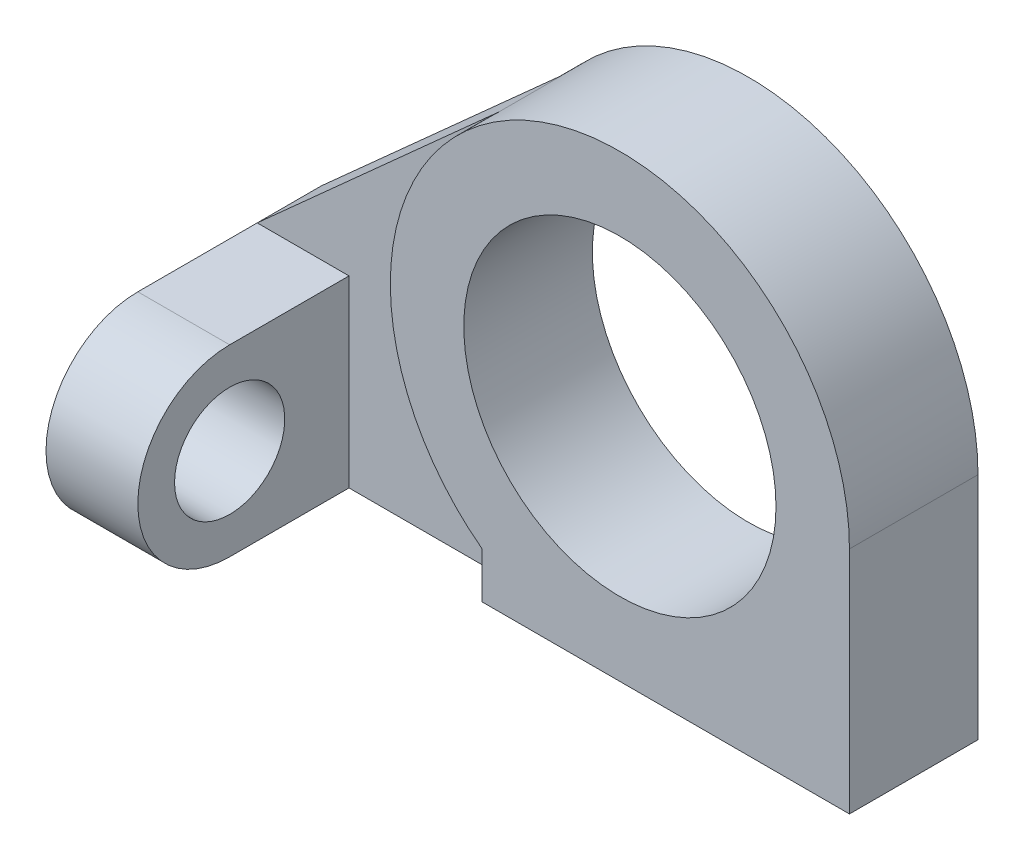
ISO-10303-21;
HEADER;
FILE_DESCRIPTION(('STEP AP214'),'2;1');
FILE_NAME('part.step','',(''),(''),'','','');
FILE_SCHEMA(('AUTOMOTIVE_DESIGN { 1 0 10303 214 1 1 1 1 }'));
ENDSEC;
DATA;
#1=APPLICATION_CONTEXT('core data for automotive mechanical design processes');
#2=APPLICATION_PROTOCOL_DEFINITION('international standard','automotive_design',2000,#1);
#3=PRODUCT_CONTEXT('',#1,'mechanical');
#4=PRODUCT('Part','Part','',(#3));
#5=PRODUCT_RELATED_PRODUCT_CATEGORY('part','',(#4));
#6=PRODUCT_DEFINITION_FORMATION('','',#4);
#7=PRODUCT_DEFINITION_CONTEXT('part definition',#1,'design');
#8=PRODUCT_DEFINITION('design','',#6,#7);
#9=PRODUCT_DEFINITION_SHAPE('','',#8);
#10=(LENGTH_UNIT() NAMED_UNIT(*) SI_UNIT(.MILLI.,.METRE.));
#11=(NAMED_UNIT(*) PLANE_ANGLE_UNIT() SI_UNIT($,.RADIAN.));
#12=(NAMED_UNIT(*) SI_UNIT($,.STERADIAN.) SOLID_ANGLE_UNIT());
#13=UNCERTAINTY_MEASURE_WITH_UNIT(LENGTH_MEASURE(1.E-05),#10,'distance_accuracy_value','');
#14=(GEOMETRIC_REPRESENTATION_CONTEXT(3) GLOBAL_UNCERTAINTY_ASSIGNED_CONTEXT((#13)) GLOBAL_UNIT_ASSIGNED_CONTEXT((#10,
#11,#12)) REPRESENTATION_CONTEXT('',''));
#15=CARTESIAN_POINT('',(0.,0.,0.));
#16=DIRECTION('',(0.,0.,1.));
#17=DIRECTION('',(1.,0.,0.));
#18=AXIS2_PLACEMENT_3D('',#15,#16,#17);
#19=CARTESIAN_POINT('',(0.,0.,3.5));
#20=DIRECTION('',(0.,0.,1.));
#21=DIRECTION('',(1.,0.,0.));
#22=AXIS2_PLACEMENT_3D('',#19,#20,#21);
#23=PLANE('',#22);
#24=DIRECTION('',(-1.,0.,0.));
#25=VECTOR('',#24,1.);
#26=CARTESIAN_POINT('',(-33.,-5.00000000000001,3.5));
#27=LINE('',#26,#25);
#28=CARTESIAN_POINT('',(-33.,-5.00000000000001,3.5));
#29=VERTEX_POINT('',#28);
#30=CARTESIAN_POINT('',(-43.,-5.00000000000001,3.5));
#31=VERTEX_POINT('',#30);
#32=EDGE_CURVE('E63',#29,#31,#27,.T.);
#33=ORIENTED_EDGE('',*,*,#32,.F.);
#34=DIRECTION('',(0.,-1.,0.));
#35=VECTOR('',#34,1.);
#36=CARTESIAN_POINT('',(-33.,-5.00000000000001,3.5));
#37=LINE('',#36,#35);
#38=CARTESIAN_POINT('',(-33.,-25.,3.5));
#39=VERTEX_POINT('',#38);
#40=EDGE_CURVE('E165',#29,#39,#37,.T.);
#41=ORIENTED_EDGE('',*,*,#40,.T.);
#42=DIRECTION('',(1.,0.,0.));
#43=VECTOR('',#42,1.);
#44=CARTESIAN_POINT('',(25.,-25.,3.5));
#45=LINE('',#44,#43);
#46=CARTESIAN_POINT('',(-15.,-25.,3.5));
#47=VERTEX_POINT('',#46);
#48=EDGE_CURVE('E153',#39,#47,#45,.T.);
#49=ORIENTED_EDGE('',*,*,#48,.T.);
#50=DIRECTION('',(0.,-1.,0.));
#51=VECTOR('',#50,1.);
#52=CARTESIAN_POINT('',(-15.,-25.,3.5));
#53=LINE('',#52,#51);
#54=CARTESIAN_POINT('',(-15.,-20.,3.5));
#55=VERTEX_POINT('',#54);
#56=EDGE_CURVE('E242',#55,#47,#53,.T.);
#57=ORIENTED_EDGE('',*,*,#56,.F.);
#58=CARTESIAN_POINT('',(0.,0.,3.5));
#59=DIRECTION('',(0.,0.,1.));
#60=DIRECTION('',(1.,0.,0.));
#61=AXIS2_PLACEMENT_3D('',#58,#59,#60);
#62=CIRCLE('',#61,25.);
#63=CARTESIAN_POINT('',(-16.6983187095881,18.6055409024575,3.5));
#64=VERTEX_POINT('',#63);
#65=EDGE_CURVE('E55',#64,#55,#62,.T.);
#66=ORIENTED_EDGE('',*,*,#65,.F.);
#67=DIRECTION('',(-0.744221636098301,-0.667932748383524,0.));
#68=VECTOR('',#67,1.);
#69=CARTESIAN_POINT('',(-43.,-5.00000000000001,3.5));
#70=LINE('',#69,#68);
#71=EDGE_CURVE('E269',#64,#31,#70,.T.);
#72=ORIENTED_EDGE('',*,*,#71,.T.);
#73=EDGE_LOOP('',(#33,#41,#49,#57,#66,#72));
#74=FACE_BOUND('',#73,.T.);
#75=ADVANCED_FACE('F45',(#74),#23,.T.);
#76=DIRECTION('',(0.,-1.,0.));
#77=VECTOR('',#76,1.);
#78=CARTESIAN_POINT('',(-43.,-5.00000000000001,3.5));
#79=LINE('',#78,#77);
#80=CARTESIAN_POINT('',(-43.,-9.00000000000001,3.5));
#81=VERTEX_POINT('',#80);
#82=CARTESIAN_POINT('',(-43.,-25.,3.5));
#83=VERTEX_POINT('',#82);
#84=EDGE_CURVE('E186',#81,#83,#79,.T.);
#85=ORIENTED_EDGE('',*,*,#84,.F.);
#86=DIRECTION('',(-1.,0.,0.));
#87=VECTOR('',#86,1.);
#88=CARTESIAN_POINT('',(-47.,-9.00000000000001,3.5));
#89=LINE('',#88,#87);
#90=CARTESIAN_POINT('',(-47.,-9.00000000000001,3.5));
#91=VERTEX_POINT('',#90);
#92=EDGE_CURVE('E272',#81,#91,#89,.T.);
#93=ORIENTED_EDGE('',*,*,#92,.T.);
#94=DIRECTION('',(0.,-1.,0.));
#95=VECTOR('',#94,1.);
#96=CARTESIAN_POINT('',(-47.,-25.,3.5));
#97=LINE('',#96,#95);
#98=CARTESIAN_POINT('',(-47.,-25.,3.5));
#99=VERTEX_POINT('',#98);
#100=EDGE_CURVE('E163',#91,#99,#97,.T.);
#101=ORIENTED_EDGE('',*,*,#100,.T.);
#102=EDGE_CURVE('E71',#99,#83,#45,.T.);
#103=ORIENTED_EDGE('',*,*,#102,.T.);
#104=EDGE_LOOP('',(#85,#93,#101,#103));
#105=FACE_BOUND('',#104,.T.);
#106=ADVANCED_FACE('F337',(#105),#23,.T.);
#107=CARTESIAN_POINT('',(0.,0.,-3.5));
#108=DIRECTION('',(0.,0.,1.));
#109=DIRECTION('',(1.,0.,0.));
#110=AXIS2_PLACEMENT_3D('',#107,#108,#109);
#111=PLANE('',#110);
#112=DIRECTION('',(-0.744221636098301,-0.667932748383524,0.));
#113=VECTOR('',#112,1.);
#114=CARTESIAN_POINT('',(-43.,-5.00000000000001,-3.5));
#115=LINE('',#114,#113);
#116=CARTESIAN_POINT('',(-16.6983187095881,18.6055409024575,-3.5));
#117=VERTEX_POINT('',#116);
#118=CARTESIAN_POINT('',(-43.,-5.00000000000001,-3.5));
#119=VERTEX_POINT('',#118);
#120=EDGE_CURVE('E268',#117,#119,#115,.T.);
#121=ORIENTED_EDGE('',*,*,#120,.F.);
#122=CARTESIAN_POINT('',(0.,0.,-3.5));
#123=DIRECTION('',(0.,0.,1.));
#124=DIRECTION('',(1.,0.,0.));
#125=AXIS2_PLACEMENT_3D('',#122,#123,#124);
#126=CIRCLE('',#125,25.);
#127=CARTESIAN_POINT('',(-15.,-20.,-3.5));
#128=VERTEX_POINT('',#127);
#129=EDGE_CURVE('E11',#117,#128,#126,.T.);
#130=ORIENTED_EDGE('',*,*,#129,.T.);
#131=DIRECTION('',(0.,-1.,0.));
#132=VECTOR('',#131,1.);
#133=CARTESIAN_POINT('',(-15.,-25.,-3.5));
#134=LINE('',#133,#132);
#135=CARTESIAN_POINT('',(-15.,-25.,-3.5));
#136=VERTEX_POINT('',#135);
#137=EDGE_CURVE('E212',#128,#136,#134,.T.);
#138=ORIENTED_EDGE('',*,*,#137,.T.);
#139=DIRECTION('',(1.,0.,0.));
#140=VECTOR('',#139,1.);
#141=CARTESIAN_POINT('',(25.,-25.,-3.5));
#142=LINE('',#141,#140);
#143=CARTESIAN_POINT('',(-47.,-25.,-3.5));
#144=VERTEX_POINT('',#143);
#145=EDGE_CURVE('E273',#144,#136,#142,.T.);
#146=ORIENTED_EDGE('',*,*,#145,.F.);
#147=DIRECTION('',(0.,-1.,0.));
#148=VECTOR('',#147,1.);
#149=CARTESIAN_POINT('',(-47.,-25.,-3.5));
#150=LINE('',#149,#148);
#151=CARTESIAN_POINT('',(-47.,-9.00000000000001,-3.5));
#152=VERTEX_POINT('',#151);
#153=EDGE_CURVE('E288',#152,#144,#150,.T.);
#154=ORIENTED_EDGE('',*,*,#153,.F.);
#155=DIRECTION('',(-1.,0.,0.));
#156=VECTOR('',#155,1.);
#157=CARTESIAN_POINT('',(-47.,-9.00000000000001,-3.5));
#158=LINE('',#157,#156);
#159=CARTESIAN_POINT('',(-43.,-9.00000000000001,-3.5));
#160=VERTEX_POINT('',#159);
#161=EDGE_CURVE('E285',#160,#152,#158,.T.);
#162=ORIENTED_EDGE('',*,*,#161,.F.);
#163=DIRECTION('',(0.,-1.,0.));
#164=VECTOR('',#163,1.);
#165=CARTESIAN_POINT('',(-43.,-9.00000000000001,-3.5));
#166=LINE('',#165,#164);
#167=EDGE_CURVE('E282',#119,#160,#166,.T.);
#168=ORIENTED_EDGE('',*,*,#167,.F.);
#169=EDGE_LOOP('',(#121,#130,#138,#146,#154,#162,#168));
#170=FACE_BOUND('',#169,.T.);
#171=ADVANCED_FACE('F326',(#170),#111,.F.);
#172=CARTESIAN_POINT('',(0.,0.,3.5));
#173=DIRECTION('',(0.,0.,-1.));
#174=DIRECTION('',(-1.,0.,0.));
#175=AXIS2_PLACEMENT_3D('',#172,#173,#174);
#176=CYLINDRICAL_SURFACE('',#175,25.);
#177=DIRECTION('',(0.,0.,-1.));
#178=VECTOR('',#177,1.);
#179=CARTESIAN_POINT('',(25.,0.,3.5));
#180=LINE('',#179,#178);
#181=CARTESIAN_POINT('',(25.,0.,7.));
#182=VERTEX_POINT('',#181);
#183=CARTESIAN_POINT('',(25.,0.,-7.));
#184=VERTEX_POINT('',#183);
#185=EDGE_CURVE('E279',#182,#184,#180,.T.);
#186=ORIENTED_EDGE('',*,*,#185,.T.);
#187=CARTESIAN_POINT('',(0.,0.,-7.));
#188=DIRECTION('',(0.,0.,1.));
#189=DIRECTION('',(1.,0.,0.));
#190=AXIS2_PLACEMENT_3D('',#187,#188,#189);
#191=CIRCLE('',#190,25.);
#192=CARTESIAN_POINT('',(-15.,-20.,-7.));
#193=VERTEX_POINT('',#192);
#194=EDGE_CURVE('E221',#184,#193,#191,.T.);
#195=ORIENTED_EDGE('',*,*,#194,.T.);
#196=DIRECTION('',(0.,0.,1.));
#197=VECTOR('',#196,1.);
#198=CARTESIAN_POINT('',(-15.,-20.,-7.));
#199=LINE('',#198,#197);
#200=EDGE_CURVE('E229',#193,#128,#199,.T.);
#201=ORIENTED_EDGE('',*,*,#200,.T.);
#202=ORIENTED_EDGE('',*,*,#129,.F.);
#203=DIRECTION('',(0.,0.,-1.));
#204=VECTOR('',#203,1.);
#205=CARTESIAN_POINT('',(-16.6983187095881,18.6055409024575,3.5));
#206=LINE('',#205,#204);
#207=EDGE_CURVE('E49',#64,#117,#206,.T.);
#208=ORIENTED_EDGE('',*,*,#207,.F.);
#209=ORIENTED_EDGE('',*,*,#65,.T.);
#210=DIRECTION('',(0.,0.,-1.));
#211=VECTOR('',#210,1.);
#212=CARTESIAN_POINT('',(-15.,-20.,7.));
#213=LINE('',#212,#211);
#214=CARTESIAN_POINT('',(-15.,-20.,7.));
#215=VERTEX_POINT('',#214);
#216=EDGE_CURVE('E264',#215,#55,#213,.T.);
#217=ORIENTED_EDGE('',*,*,#216,.F.);
#218=CARTESIAN_POINT('',(0.,0.,7.));
#219=DIRECTION('',(0.,0.,1.));
#220=DIRECTION('',(1.,0.,0.));
#221=AXIS2_PLACEMENT_3D('',#218,#219,#220);
#222=CIRCLE('',#221,25.);
#223=EDGE_CURVE('E251',#182,#215,#222,.T.);
#224=ORIENTED_EDGE('',*,*,#223,.F.);
#225=EDGE_LOOP('',(#186,#195,#201,#202,#208,#209,#217,#224));
#226=FACE_BOUND('',#225,.T.);
#227=ADVANCED_FACE('F47',(#226),#176,.T.);
#228=CARTESIAN_POINT('',(-43.,-5.00000000000001,3.5));
#229=DIRECTION('',(0.667932748383524,-0.744221636098301,0.));
#230=DIRECTION('',(0.744221636098301,0.667932748383524,0.));
#231=AXIS2_PLACEMENT_3D('',#228,#229,#230);
#232=PLANE('',#231);
#233=ORIENTED_EDGE('',*,*,#120,.T.);
#234=DIRECTION('',(0.,0.,-1.));
#235=VECTOR('',#234,1.);
#236=CARTESIAN_POINT('',(-43.,-5.00000000000001,3.5));
#237=LINE('',#236,#235);
#238=EDGE_CURVE('E309',#31,#119,#237,.T.);
#239=ORIENTED_EDGE('',*,*,#238,.F.);
#240=ORIENTED_EDGE('',*,*,#71,.F.);
#241=ORIENTED_EDGE('',*,*,#207,.T.);
#242=EDGE_LOOP('',(#233,#239,#240,#241));
#243=FACE_BOUND('',#242,.T.);
#244=ADVANCED_FACE('F320',(#243),#232,.F.);
#245=CARTESIAN_POINT('',(-43.,-9.00000000000001,3.5));
#246=DIRECTION('',(1.,0.,0.));
#247=DIRECTION('',(0.,0.,-1.));
#248=AXIS2_PLACEMENT_3D('',#245,#246,#247);
#249=PLANE('',#248);
#250=ORIENTED_EDGE('',*,*,#167,.T.);
#251=DIRECTION('',(0.,0.,-1.));
#252=VECTOR('',#251,1.);
#253=CARTESIAN_POINT('',(-43.,-9.00000000000001,3.5));
#254=LINE('',#253,#252);
#255=EDGE_CURVE('E306',#81,#160,#254,.T.);
#256=ORIENTED_EDGE('',*,*,#255,.F.);
#257=ORIENTED_EDGE('',*,*,#84,.T.);
#258=DIRECTION('',(0.,0.,1.));
#259=VECTOR('',#258,1.);
#260=CARTESIAN_POINT('',(-43.,-25.,3.5));
#261=LINE('',#260,#259);
#262=CARTESIAN_POINT('',(-43.,-25.,16.5));
#263=VERTEX_POINT('',#262);
#264=EDGE_CURVE('E189',#83,#263,#261,.T.);
#265=ORIENTED_EDGE('',*,*,#264,.T.);
#266=CARTESIAN_POINT('',(-43.,-15.,16.5));
#267=DIRECTION('',(-1.,0.,0.));
#268=DIRECTION('',(0.,0.,1.));
#269=AXIS2_PLACEMENT_3D('',#266,#267,#268);
#270=CIRCLE('',#269,10.);
#271=CARTESIAN_POINT('',(-43.,-5.00000000000001,16.5));
#272=VERTEX_POINT('',#271);
#273=EDGE_CURVE('E194',#263,#272,#270,.T.);
#274=ORIENTED_EDGE('',*,*,#273,.T.);
#275=DIRECTION('',(0.,0.,-1.));
#276=VECTOR('',#275,1.);
#277=CARTESIAN_POINT('',(-43.,-5.00000000000001,3.5));
#278=LINE('',#277,#276);
#279=EDGE_CURVE('E170',#272,#31,#278,.T.);
#280=ORIENTED_EDGE('',*,*,#279,.T.);
#281=ORIENTED_EDGE('',*,*,#238,.T.);
#282=EDGE_LOOP('',(#250,#256,#257,#265,#274,#280,#281));
#283=FACE_BOUND('',#282,.T.);
#284=CARTESIAN_POINT('',(-43.,-15.,16.5));
#285=DIRECTION('',(-1.,0.,0.));
#286=DIRECTION('',(0.,0.,1.));
#287=AXIS2_PLACEMENT_3D('',#284,#285,#286);
#288=CIRCLE('',#287,6.);
#289=CARTESIAN_POINT('',(-43.,-15.,22.5));
#290=VERTEX_POINT('',#289);
#291=EDGE_CURVE('E477',#290,#290,#288,.T.);
#292=ORIENTED_EDGE('',*,*,#291,.F.);
#293=EDGE_LOOP('',(#292));
#294=FACE_BOUND('',#293,.T.);
#295=ADVANCED_FACE('F330',(#283,#294),#249,.F.);
#296=CARTESIAN_POINT('',(-47.,-9.00000000000001,3.5));
#297=DIRECTION('',(0.,-1.,0.));
#298=DIRECTION('',(0.,0.,-1.));
#299=AXIS2_PLACEMENT_3D('',#296,#297,#298);
#300=PLANE('',#299);
#301=ORIENTED_EDGE('',*,*,#161,.T.);
#302=DIRECTION('',(0.,0.,-1.));
#303=VECTOR('',#302,1.);
#304=CARTESIAN_POINT('',(-47.,-9.00000000000001,3.5));
#305=LINE('',#304,#303);
#306=EDGE_CURVE('E302',#91,#152,#305,.T.);
#307=ORIENTED_EDGE('',*,*,#306,.F.);
#308=ORIENTED_EDGE('',*,*,#92,.F.);
#309=ORIENTED_EDGE('',*,*,#255,.T.);
#310=EDGE_LOOP('',(#301,#307,#308,#309));
#311=FACE_BOUND('',#310,.T.);
#312=ADVANCED_FACE('F334',(#311),#300,.F.);
#313=CARTESIAN_POINT('',(-47.,-25.,3.5));
#314=DIRECTION('',(1.,0.,0.));
#315=DIRECTION('',(0.,0.,-1.));
#316=AXIS2_PLACEMENT_3D('',#313,#314,#315);
#317=PLANE('',#316);
#318=ORIENTED_EDGE('',*,*,#153,.T.);
#319=DIRECTION('',(0.,0.,-1.));
#320=VECTOR('',#319,1.);
#321=CARTESIAN_POINT('',(-47.,-25.,3.5));
#322=LINE('',#321,#320);
#323=EDGE_CURVE('E298',#99,#144,#322,.T.);
#324=ORIENTED_EDGE('',*,*,#323,.F.);
#325=ORIENTED_EDGE('',*,*,#100,.F.);
#326=ORIENTED_EDGE('',*,*,#306,.T.);
#327=EDGE_LOOP('',(#318,#324,#325,#326));
#328=FACE_BOUND('',#327,.T.);
#329=ADVANCED_FACE('F375',(#328),#317,.F.);
#330=CARTESIAN_POINT('',(25.,-25.,3.5));
#331=DIRECTION('',(0.,1.,0.));
#332=DIRECTION('',(-1.,0.,0.));
#333=AXIS2_PLACEMENT_3D('',#330,#331,#332);
#334=PLANE('',#333);
#335=ORIENTED_EDGE('',*,*,#145,.T.);
#336=DIRECTION('',(0.,0.,1.));
#337=VECTOR('',#336,1.);
#338=CARTESIAN_POINT('',(-15.,-25.,-7.));
#339=LINE('',#338,#337);
#340=CARTESIAN_POINT('',(-15.,-25.,-7.));
#341=VERTEX_POINT('',#340);
#342=EDGE_CURVE('E235',#341,#136,#339,.T.);
#343=ORIENTED_EDGE('',*,*,#342,.F.);
#344=DIRECTION('',(1.,0.,0.));
#345=VECTOR('',#344,1.);
#346=CARTESIAN_POINT('',(-15.,-25.,-7.));
#347=LINE('',#346,#345);
#348=CARTESIAN_POINT('',(25.,-25.,-7.));
#349=VERTEX_POINT('',#348);
#350=EDGE_CURVE('E213',#341,#349,#347,.T.);
#351=ORIENTED_EDGE('',*,*,#350,.T.);
#352=DIRECTION('',(0.,0.,-1.));
#353=VECTOR('',#352,1.);
#354=CARTESIAN_POINT('',(25.,-25.,3.5));
#355=LINE('',#354,#353);
#356=CARTESIAN_POINT('',(25.,-25.,7.));
#357=VERTEX_POINT('',#356);
#358=EDGE_CURVE('E295',#357,#349,#355,.T.);
#359=ORIENTED_EDGE('',*,*,#358,.F.);
#360=DIRECTION('',(1.,0.,0.));
#361=VECTOR('',#360,1.);
#362=CARTESIAN_POINT('',(-15.,-25.,7.));
#363=LINE('',#362,#361);
#364=CARTESIAN_POINT('',(-15.,-25.,7.));
#365=VERTEX_POINT('',#364);
#366=EDGE_CURVE('E243',#365,#357,#363,.T.);
#367=ORIENTED_EDGE('',*,*,#366,.F.);
#368=DIRECTION('',(0.,0.,-1.));
#369=VECTOR('',#368,1.);
#370=CARTESIAN_POINT('',(-15.,-25.,7.));
#371=LINE('',#370,#369);
#372=EDGE_CURVE('E160',#365,#47,#371,.T.);
#373=ORIENTED_EDGE('',*,*,#372,.T.);
#374=ORIENTED_EDGE('',*,*,#48,.F.);
#375=DIRECTION('',(0.,0.,1.));
#376=VECTOR('',#375,1.);
#377=CARTESIAN_POINT('',(-33.,-25.,3.5));
#378=LINE('',#377,#376);
#379=CARTESIAN_POINT('',(-33.,-25.,16.5));
#380=VERTEX_POINT('',#379);
#381=EDGE_CURVE('E157',#39,#380,#378,.T.);
#382=ORIENTED_EDGE('',*,*,#381,.T.);
#383=DIRECTION('',(-1.,0.,0.));
#384=VECTOR('',#383,1.);
#385=CARTESIAN_POINT('',(-33.,-25.,16.5));
#386=LINE('',#385,#384);
#387=EDGE_CURVE('E185',#380,#263,#386,.T.);
#388=ORIENTED_EDGE('',*,*,#387,.T.);
#389=ORIENTED_EDGE('',*,*,#264,.F.);
#390=ORIENTED_EDGE('',*,*,#102,.F.);
#391=ORIENTED_EDGE('',*,*,#323,.T.);
#392=EDGE_LOOP('',(#335,#343,#351,#359,#367,#373,#374,#382,#388,#389,#390,#391));
#393=FACE_BOUND('',#392,.T.);
#394=ADVANCED_FACE('F155',(#393),#334,.F.);
#395=CARTESIAN_POINT('',(25.,0.,3.5));
#396=DIRECTION('',(-1.,0.,0.));
#397=DIRECTION('',(0.,0.,1.));
#398=AXIS2_PLACEMENT_3D('',#395,#396,#397);
#399=PLANE('',#398);
#400=ORIENTED_EDGE('',*,*,#358,.T.);
#401=DIRECTION('',(0.,1.,0.));
#402=VECTOR('',#401,1.);
#403=CARTESIAN_POINT('',(25.,-25.,-7.));
#404=LINE('',#403,#402);
#405=EDGE_CURVE('E225',#349,#184,#404,.T.);
#406=ORIENTED_EDGE('',*,*,#405,.T.);
#407=ORIENTED_EDGE('',*,*,#185,.F.);
#408=DIRECTION('',(0.,1.,0.));
#409=VECTOR('',#408,1.);
#410=CARTESIAN_POINT('',(25.,-25.,7.));
#411=LINE('',#410,#409);
#412=EDGE_CURVE('E247',#357,#182,#411,.T.);
#413=ORIENTED_EDGE('',*,*,#412,.F.);
#414=EDGE_LOOP('',(#400,#406,#407,#413));
#415=FACE_BOUND('',#414,.T.);
#416=ADVANCED_FACE('F370',(#415),#399,.F.);
#417=CARTESIAN_POINT('',(0.,0.,3.5));
#418=DIRECTION('',(0.,0.,-1.));
#419=DIRECTION('',(-1.,0.,0.));
#420=AXIS2_PLACEMENT_3D('',#417,#418,#419);
#421=CYLINDRICAL_SURFACE('',#420,17.);
#422=CARTESIAN_POINT('',(0.,0.,7.));
#423=DIRECTION('',(0.,0.,1.));
#424=DIRECTION('',(1.,0.,0.));
#425=AXIS2_PLACEMENT_3D('',#422,#423,#424);
#426=CIRCLE('',#425,17.);
#427=CARTESIAN_POINT('',(17.,0.,7.));
#428=VERTEX_POINT('',#427);
#429=EDGE_CURVE('E238',#428,#428,#426,.T.);
#430=ORIENTED_EDGE('',*,*,#429,.T.);
#431=EDGE_LOOP('',(#430));
#432=FACE_BOUND('',#431,.T.);
#433=CARTESIAN_POINT('',(0.,0.,-7.));
#434=DIRECTION('',(0.,0.,1.));
#435=DIRECTION('',(1.,0.,0.));
#436=AXIS2_PLACEMENT_3D('',#433,#434,#435);
#437=CIRCLE('',#436,17.);
#438=CARTESIAN_POINT('',(17.,0.,-7.));
#439=VERTEX_POINT('',#438);
#440=EDGE_CURVE('E203',#439,#439,#437,.T.);
#441=ORIENTED_EDGE('',*,*,#440,.F.);
#442=EDGE_LOOP('',(#441));
#443=FACE_BOUND('',#442,.T.);
#444=ADVANCED_FACE('F366',(#432,#443),#421,.F.);
#445=CARTESIAN_POINT('',(0.,0.,7.));
#446=DIRECTION('',(0.,0.,1.));
#447=DIRECTION('',(1.,0.,0.));
#448=AXIS2_PLACEMENT_3D('',#445,#446,#447);
#449=PLANE('',#448);
#450=ORIENTED_EDGE('',*,*,#366,.T.);
#451=ORIENTED_EDGE('',*,*,#412,.T.);
#452=ORIENTED_EDGE('',*,*,#223,.T.);
#453=DIRECTION('',(0.,-1.,0.));
#454=VECTOR('',#453,1.);
#455=CARTESIAN_POINT('',(-15.,-25.,7.));
#456=LINE('',#455,#454);
#457=EDGE_CURVE('E254',#215,#365,#456,.T.);
#458=ORIENTED_EDGE('',*,*,#457,.T.);
#459=EDGE_LOOP('',(#450,#451,#452,#458));
#460=FACE_BOUND('',#459,.T.);
#461=ORIENTED_EDGE('',*,*,#429,.F.);
#462=EDGE_LOOP('',(#461));
#463=FACE_BOUND('',#462,.T.);
#464=ADVANCED_FACE('F405',(#460,#463),#449,.T.);
#465=CARTESIAN_POINT('',(-15.,-25.,7.));
#466=DIRECTION('',(1.,0.,0.));
#467=DIRECTION('',(0.,0.,-1.));
#468=AXIS2_PLACEMENT_3D('',#465,#466,#467);
#469=PLANE('',#468);
#470=ORIENTED_EDGE('',*,*,#56,.T.);
#471=ORIENTED_EDGE('',*,*,#372,.F.);
#472=ORIENTED_EDGE('',*,*,#457,.F.);
#473=ORIENTED_EDGE('',*,*,#216,.T.);
#474=EDGE_LOOP('',(#470,#471,#472,#473));
#475=FACE_BOUND('',#474,.T.);
#476=ADVANCED_FACE('F412',(#475),#469,.F.);
#477=CARTESIAN_POINT('',(-15.,-25.,-7.));
#478=DIRECTION('',(-1.,0.,0.));
#479=DIRECTION('',(0.,0.,1.));
#480=AXIS2_PLACEMENT_3D('',#477,#478,#479);
#481=PLANE('',#480);
#482=ORIENTED_EDGE('',*,*,#137,.F.);
#483=ORIENTED_EDGE('',*,*,#200,.F.);
#484=DIRECTION('',(0.,-1.,0.));
#485=VECTOR('',#484,1.);
#486=CARTESIAN_POINT('',(-15.,-25.,-7.));
#487=LINE('',#486,#485);
#488=EDGE_CURVE('E217',#193,#341,#487,.T.);
#489=ORIENTED_EDGE('',*,*,#488,.T.);
#490=ORIENTED_EDGE('',*,*,#342,.T.);
#491=EDGE_LOOP('',(#482,#483,#489,#490));
#492=FACE_BOUND('',#491,.T.);
#493=ADVANCED_FACE('F355',(#492),#481,.T.);
#494=CARTESIAN_POINT('',(0.,0.,-7.));
#495=DIRECTION('',(0.,0.,-1.));
#496=DIRECTION('',(1.,0.,0.));
#497=AXIS2_PLACEMENT_3D('',#494,#495,#496);
#498=PLANE('',#497);
#499=ORIENTED_EDGE('',*,*,#440,.T.);
#500=EDGE_LOOP('',(#499));
#501=FACE_BOUND('',#500,.T.);
#502=ORIENTED_EDGE('',*,*,#350,.F.);
#503=ORIENTED_EDGE('',*,*,#488,.F.);
#504=ORIENTED_EDGE('',*,*,#194,.F.);
#505=ORIENTED_EDGE('',*,*,#405,.F.);
#506=EDGE_LOOP('',(#502,#503,#504,#505));
#507=FACE_BOUND('',#506,.T.);
#508=ADVANCED_FACE('F347',(#501,#507),#498,.T.);
#509=CARTESIAN_POINT('',(-33.,-5.00000000000001,3.5));
#510=DIRECTION('',(0.,1.,0.));
#511=DIRECTION('',(0.,0.,1.));
#512=AXIS2_PLACEMENT_3D('',#509,#510,#511);
#513=PLANE('',#512);
#514=ORIENTED_EDGE('',*,*,#279,.F.);
#515=DIRECTION('',(-1.,0.,0.));
#516=VECTOR('',#515,1.);
#517=CARTESIAN_POINT('',(-33.,-5.00000000000001,16.5));
#518=LINE('',#517,#516);
#519=CARTESIAN_POINT('',(-33.,-5.00000000000001,16.5));
#520=VERTEX_POINT('',#519);
#521=EDGE_CURVE('E204',#520,#272,#518,.T.);
#522=ORIENTED_EDGE('',*,*,#521,.F.);
#523=DIRECTION('',(0.,0.,-1.));
#524=VECTOR('',#523,1.);
#525=CARTESIAN_POINT('',(-33.,-5.00000000000001,3.5));
#526=LINE('',#525,#524);
#527=EDGE_CURVE('E179',#520,#29,#526,.T.);
#528=ORIENTED_EDGE('',*,*,#527,.T.);
#529=ORIENTED_EDGE('',*,*,#32,.T.);
#530=EDGE_LOOP('',(#514,#522,#528,#529));
#531=FACE_BOUND('',#530,.T.);
#532=ADVANCED_FACE('F345',(#531),#513,.T.);
#533=CARTESIAN_POINT('',(-33.,-15.,16.5));
#534=DIRECTION('',(-1.,0.,0.));
#535=DIRECTION('',(0.,0.,1.));
#536=AXIS2_PLACEMENT_3D('',#533,#534,#535);
#537=CYLINDRICAL_SURFACE('',#536,10.);
#538=ORIENTED_EDGE('',*,*,#273,.F.);
#539=ORIENTED_EDGE('',*,*,#387,.F.);
#540=CARTESIAN_POINT('',(-33.,-15.,16.5));
#541=DIRECTION('',(-1.,0.,0.));
#542=DIRECTION('',(0.,0.,1.));
#543=AXIS2_PLACEMENT_3D('',#540,#541,#542);
#544=CIRCLE('',#543,10.);
#545=EDGE_CURVE('E175',#380,#520,#544,.T.);
#546=ORIENTED_EDGE('',*,*,#545,.T.);
#547=ORIENTED_EDGE('',*,*,#521,.T.);
#548=EDGE_LOOP('',(#538,#539,#546,#547));
#549=FACE_BOUND('',#548,.T.);
#550=ADVANCED_FACE('F342',(#549),#537,.T.);
#551=CARTESIAN_POINT('',(-33.,-15.,16.5));
#552=DIRECTION('',(-1.,0.,0.));
#553=DIRECTION('',(0.,0.,1.));
#554=AXIS2_PLACEMENT_3D('',#551,#552,#553);
#555=PLANE('',#554);
#556=CARTESIAN_POINT('',(-33.,-15.,16.5));
#557=DIRECTION('',(-1.,0.,0.));
#558=DIRECTION('',(0.,0.,1.));
#559=AXIS2_PLACEMENT_3D('',#556,#557,#558);
#560=CIRCLE('',#559,6.);
#561=CARTESIAN_POINT('',(-33.,-15.,22.5));
#562=VERTEX_POINT('',#561);
#563=EDGE_CURVE('E190',#562,#562,#560,.T.);
#564=ORIENTED_EDGE('',*,*,#563,.T.);
#565=EDGE_LOOP('',(#564));
#566=FACE_BOUND('',#565,.T.);
#567=ORIENTED_EDGE('',*,*,#40,.F.);
#568=ORIENTED_EDGE('',*,*,#527,.F.);
#569=ORIENTED_EDGE('',*,*,#545,.F.);
#570=ORIENTED_EDGE('',*,*,#381,.F.);
#571=EDGE_LOOP('',(#567,#568,#569,#570));
#572=FACE_BOUND('',#571,.T.);
#573=ADVANCED_FACE('F173',(#566,#572),#555,.F.);
#574=CARTESIAN_POINT('',(-33.,-15.,16.5));
#575=DIRECTION('',(-1.,0.,0.));
#576=DIRECTION('',(0.,0.,1.));
#577=AXIS2_PLACEMENT_3D('',#574,#575,#576);
#578=CYLINDRICAL_SURFACE('',#577,6.);
#579=ORIENTED_EDGE('',*,*,#563,.F.);
#580=EDGE_LOOP('',(#579));
#581=FACE_BOUND('',#580,.T.);
#582=ORIENTED_EDGE('',*,*,#291,.T.);
#583=EDGE_LOOP('',(#582));
#584=FACE_BOUND('',#583,.T.);
#585=ADVANCED_FACE('F460',(#581,#584),#578,.F.);
#586=CLOSED_SHELL('',(#75,#106,#171,#227,#244,#295,#312,#329,#394,#416,#444,#464,#476,#493,#508,
#532,#550,#573,#585));
#587=MANIFOLD_SOLID_BREP('B2',#586);
#588=ADVANCED_BREP_SHAPE_REPRESENTATION('',(#18,#587),#14);
#589=SHAPE_DEFINITION_REPRESENTATION(#9,#588);
ENDSEC;
END-ISO-10303-21;
